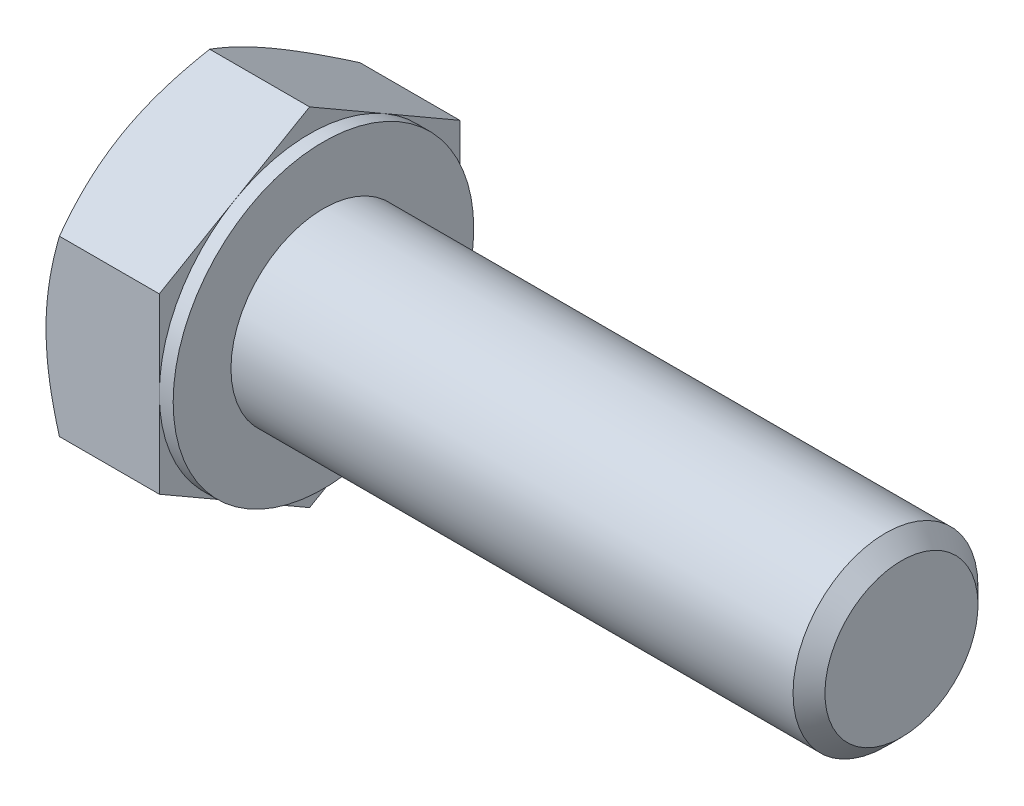
ISO-10303-21;
HEADER;
FILE_DESCRIPTION(('STEP AP214'),'2;1');
FILE_NAME('part.step','',(''),(''),'','','');
FILE_SCHEMA(('AUTOMOTIVE_DESIGN { 1 0 10303 214 1 1 1 1 }'));
ENDSEC;
DATA;
#1=APPLICATION_CONTEXT('core data for automotive mechanical design processes');
#2=APPLICATION_PROTOCOL_DEFINITION('international standard','automotive_design',2000,#1);
#3=PRODUCT_CONTEXT('',#1,'mechanical');
#4=PRODUCT('Part','Part','',(#3));
#5=PRODUCT_RELATED_PRODUCT_CATEGORY('part','',(#4));
#6=PRODUCT_DEFINITION_FORMATION('','',#4);
#7=PRODUCT_DEFINITION_CONTEXT('part definition',#1,'design');
#8=PRODUCT_DEFINITION('design','',#6,#7);
#9=PRODUCT_DEFINITION_SHAPE('','',#8);
#10=(LENGTH_UNIT() NAMED_UNIT(*) SI_UNIT(.MILLI.,.METRE.));
#11=(NAMED_UNIT(*) PLANE_ANGLE_UNIT() SI_UNIT($,.RADIAN.));
#12=(NAMED_UNIT(*) SI_UNIT($,.STERADIAN.) SOLID_ANGLE_UNIT());
#13=UNCERTAINTY_MEASURE_WITH_UNIT(LENGTH_MEASURE(1.E-05),#10,'distance_accuracy_value','');
#14=(GEOMETRIC_REPRESENTATION_CONTEXT(3) GLOBAL_UNCERTAINTY_ASSIGNED_CONTEXT((#13)) GLOBAL_UNIT_ASSIGNED_CONTEXT((#10,
#11,#12)) REPRESENTATION_CONTEXT('',''));
#15=CARTESIAN_POINT('',(0.,0.,0.));
#16=DIRECTION('',(0.,0.,1.));
#17=DIRECTION('',(1.,0.,0.));
#18=AXIS2_PLACEMENT_3D('',#15,#16,#17);
#19=CARTESIAN_POINT('',(0.,7.50555349946514,0.));
#20=DIRECTION('',(1.,0.,0.));
#21=DIRECTION('',(0.,0.,-1.));
#22=AXIS2_PLACEMENT_3D('',#19,#20,#21);
#23=PLANE('',#22);
#24=CARTESIAN_POINT('',(0.,0.,0.));
#25=DIRECTION('',(1.,0.,0.));
#26=DIRECTION('',(0.,0.,-1.));
#27=AXIS2_PLACEMENT_3D('',#24,#25,#26);
#28=CIRCLE('',#27,6.49999999995998);
#29=CARTESIAN_POINT('',(1.15546531814981E-11,-5.62916512458152,-3.24999999999));
#30=VERTEX_POINT('',#29);
#31=CARTESIAN_POINT('',(1.15518155498369E-11,0.,-6.49999999997999));
#32=VERTEX_POINT('',#31);
#33=EDGE_CURVE('E85',#30,#32,#28,.T.);
#34=ORIENTED_EDGE('',*,*,#33,.F.);
#35=CARTESIAN_POINT('',(0.,0.,0.));
#36=DIRECTION('',(1.,0.,0.));
#37=DIRECTION('',(0.,0.,-1.));
#38=AXIS2_PLACEMENT_3D('',#35,#36,#37);
#39=CIRCLE('',#38,6.49999999995998);
#40=CARTESIAN_POINT('',(1.15535774221326E-11,-5.62916512458152,3.24999999999001));
#41=VERTEX_POINT('',#40);
#42=EDGE_CURVE('E20',#41,#30,#39,.T.);
#43=ORIENTED_EDGE('',*,*,#42,.F.);
#44=CARTESIAN_POINT('',(0.,0.,0.));
#45=DIRECTION('',(1.,0.,0.));
#46=DIRECTION('',(0.,0.,-1.));
#47=AXIS2_PLACEMENT_3D('',#44,#45,#46);
#48=CIRCLE('',#47,6.49999999995998);
#49=CARTESIAN_POINT('',(1.15519510751084E-11,0.,6.49999999997999));
#50=VERTEX_POINT('',#49);
#51=EDGE_CURVE('E425',#50,#41,#48,.T.);
#52=ORIENTED_EDGE('',*,*,#51,.F.);
#53=CARTESIAN_POINT('',(0.,0.,0.));
#54=DIRECTION('',(1.,0.,0.));
#55=DIRECTION('',(0.,0.,-1.));
#56=AXIS2_PLACEMENT_3D('',#53,#54,#55);
#57=CIRCLE('',#56,6.49999999995998);
#58=CARTESIAN_POINT('',(1.1552080213042E-11,5.62916512458152,3.24999999999));
#59=VERTEX_POINT('',#58);
#60=EDGE_CURVE('E143',#59,#50,#57,.T.);
#61=ORIENTED_EDGE('',*,*,#60,.F.);
#62=CARTESIAN_POINT('',(0.,0.,0.));
#63=DIRECTION('',(1.,0.,0.));
#64=DIRECTION('',(0.,0.,-1.));
#65=AXIS2_PLACEMENT_3D('',#62,#63,#64);
#66=CIRCLE('',#65,6.49999999995998);
#67=CARTESIAN_POINT('',(1.15517781399171E-11,5.62916512458152,-3.24999999999));
#68=VERTEX_POINT('',#67);
#69=EDGE_CURVE('E426',#68,#59,#66,.T.);
#70=ORIENTED_EDGE('',*,*,#69,.F.);
#71=CARTESIAN_POINT('',(0.,0.,0.));
#72=DIRECTION('',(1.,0.,0.));
#73=DIRECTION('',(0.,0.,-1.));
#74=AXIS2_PLACEMENT_3D('',#71,#72,#73);
#75=CIRCLE('',#74,6.49999999995998);
#76=EDGE_CURVE('E88',#32,#68,#75,.T.);
#77=ORIENTED_EDGE('',*,*,#76,.F.);
#78=EDGE_LOOP('',(#34,#43,#52,#61,#70,#77));
#79=FACE_BOUND('',#78,.T.);
#80=ADVANCED_FACE('F17',(#79),#23,.F.);
#81=CARTESIAN_POINT('',(0.584039923069213,0.,0.));
#82=DIRECTION('',(1.,0.,0.));
#83=DIRECTION('',(0.,0.,-1.));
#84=AXIS2_PLACEMENT_3D('',#81,#82,#83);
#85=CONICAL_SURFACE('',#84,7.51158682032838,1.04719755118114);
#86=ORIENTED_EDGE('',*,*,#42,.T.);
#87=CARTESIAN_POINT('',(2.38325579768452E-11,-5.62916512459777,-3.24999999999938));
#88=CARTESIAN_POINT('',(-2.65652344197939E-05,-5.70880728473444,-3.11205573221975));
#89=CARTESIAN_POINT('',(0.0033797276327546,-5.78844560823781,-2.97411810968296));
#90=CARTESIAN_POINT('',(0.016860583058583,-5.94756588426545,-2.69851370708918));
#91=CARTESIAN_POINT('',(0.0269338255103951,-6.0270478646226,-2.56084687882423));
#92=CARTESIAN_POINT('',(0.0534848017047234,-6.18534206384329,-2.28667328323044));
#93=CARTESIAN_POINT('',(0.0699302938058354,-6.26415564509039,-2.15016415618406));
#94=CARTESIAN_POINT('',(0.108872020471756,-6.42140731241903,-1.87779627879596));
#95=CARTESIAN_POINT('',(0.131368414300897,-6.49984538856168,-1.74193754566893));
#96=CARTESIAN_POINT('',(0.207238975570002,-6.73427122699104,-1.33590008290232));
#97=CARTESIAN_POINT('',(0.269031363404723,-6.88957797343333,-1.06690090730607));
#98=CARTESIAN_POINT('',(0.41154041463193,-7.19885589649827,-0.531215830898221));
#99=CARTESIAN_POINT('',(0.492351589124999,-7.35281628522807,-0.264548615265171));
#100=CARTESIAN_POINT('',(0.580556583641226,-7.50555349945931,-1.01125705032068E-11));
#101=B_SPLINE_CURVE_WITH_KNOTS('',3,(#87,#88,#89,#90,#91,#92,#93,#94,#95,#96,#97,#98,#99,#100),
.UNSPECIFIED.,.F.,.F.,(4,2,2,2,2,2,4),(0.,0.4778041950496,0.95551380951934,1.43083727329502,
1.90617324917007,2.85559935539958,3.80984701130552),.UNSPECIFIED.);
#102=CARTESIAN_POINT('',(0.580556583641226,-7.50555349945931,0.));
#103=VERTEX_POINT('',#102);
#104=EDGE_CURVE('E100',#30,#103,#101,.T.);
#105=ORIENTED_EDGE('',*,*,#104,.T.);
#106=CARTESIAN_POINT('',(0.580556583641226,-7.50555349945931,1.01147123436235E-11));
#107=CARTESIAN_POINT('',(0.492351589125005,-7.35281628522806,0.264548615265161));
#108=CARTESIAN_POINT('',(0.411540414631936,-7.19885589649828,0.531215830898202));
#109=CARTESIAN_POINT('',(0.269031363404727,-6.88957797343335,1.06690090730604));
#110=CARTESIAN_POINT('',(0.207238975570004,-6.73427122699106,1.33590008290229));
#111=CARTESIAN_POINT('',(0.131368414300904,-6.49984538856169,1.74193754566889));
#112=CARTESIAN_POINT('',(0.108872020471767,-6.42140731241905,1.87779627879591));
#113=CARTESIAN_POINT('',(0.0699302938058367,-6.26415564509043,2.150164156184));
#114=CARTESIAN_POINT('',(0.0534848017047109,-6.18534206384335,2.28667328323039));
#115=CARTESIAN_POINT('',(0.0269338255104189,-6.02704786462262,2.56084687882413));
#116=CARTESIAN_POINT('',(0.0168605830586569,-5.9475658842654,2.69851370708902));
#117=CARTESIAN_POINT('',(0.00337972763268682,-5.78844560823798,2.9741181096829));
#118=CARTESIAN_POINT('',(-2.65652346796055E-05,-5.7088072847349,3.11205573221983));
#119=CARTESIAN_POINT('',(2.31066127431789E-11,-5.62916512459895,3.24999999999984));
#120=B_SPLINE_CURVE_WITH_KNOTS('',3,(#106,#107,#108,#109,#110,#111,#112,#113,#114,#115,#116,
#117,#118,#119),.UNSPECIFIED.,.F.,.F.,(4,2,2,2,2,2,4),(0.,0.954247655905908,1.90367376213542,
2.37900973801043,2.85433320178609,3.33204281625579,3.80984701130534),.UNSPECIFIED.);
#121=EDGE_CURVE('E106',#103,#41,#120,.T.);
#122=ORIENTED_EDGE('',*,*,#121,.T.);
#123=EDGE_LOOP('',(#86,#105,#122));
#124=FACE_BOUND('',#123,.T.);
#125=ADVANCED_FACE('F104',(#124),#85,.T.);
#126=CARTESIAN_POINT('',(0.584039923069213,0.,0.));
#127=DIRECTION('',(1.,0.,0.));
#128=DIRECTION('',(0.,0.,-1.));
#129=AXIS2_PLACEMENT_3D('',#126,#127,#128);
#130=CONICAL_SURFACE('',#129,7.51158682032838,1.04719755118114);
#131=ORIENTED_EDGE('',*,*,#33,.T.);
#132=CARTESIAN_POINT('',(2.38257762244022E-11,0.,-6.49999999999875));
#133=CARTESIAN_POINT('',(-2.65652344264496E-05,-0.159284320271938,-6.49999999999955));
#134=CARTESIAN_POINT('',(0.00337972763274824,-0.318560967278108,-6.49999999999988));
#135=CARTESIAN_POINT('',(0.0168605830585772,-0.636801519332982,-6.50000000000012));
#136=CARTESIAN_POINT('',(0.0269338255103896,-0.79576548004743,-6.50000000000003));
#137=CARTESIAN_POINT('',(0.053484801704718,-1.11235387848891,-6.49999999999997));
#138=CARTESIAN_POINT('',(0.0699302938058299,-1.26998104098307,-6.49999999999999));
#139=CARTESIAN_POINT('',(0.10887202047175,-1.58448437564033,-6.50000000000001));
#140=CARTESIAN_POINT('',(0.131368414300891,-1.74136052792563,-6.5));
#141=CARTESIAN_POINT('',(0.207238975569996,-2.21021220478437,-6.49999999999999));
#142=CARTESIAN_POINT('',(0.269031363404717,-2.52082569766895,-6.5));
#143=CARTESIAN_POINT('',(0.411540414631923,-3.13938154379882,-6.5));
#144=CARTESIAN_POINT('',(0.492351589124993,-3.4473023212584,-6.50000000000001));
#145=CARTESIAN_POINT('',(0.58055658364122,-3.7527767497209,-6.5));
#146=B_SPLINE_CURVE_WITH_KNOTS('',3,(#132,#133,#134,#135,#136,#137,#138,#139,#140,#141,#142,
#143,#144,#145),.UNSPECIFIED.,.F.,.F.,(4,2,2,2,2,2,4),(0.,0.477804195049599,0.955513809519338,
1.43083727329502,1.90617324917006,2.85559935539958,3.80984701130552),.UNSPECIFIED.);
#147=CARTESIAN_POINT('',(0.58055658364122,-3.75277674972966,-6.49999999999494));
#148=VERTEX_POINT('',#147);
#149=EDGE_CURVE('E95',#32,#148,#146,.T.);
#150=ORIENTED_EDGE('',*,*,#149,.T.);
#151=CARTESIAN_POINT('',(0.58055658364122,-3.75277674973842,-6.49999999998988));
#152=CARTESIAN_POINT('',(0.492351589125,-3.90551396396966,-6.23545138473484));
#153=CARTESIAN_POINT('',(0.411540414631933,-4.05947435269944,-5.9687841691018));
#154=CARTESIAN_POINT('',(0.269031363404726,-4.36875227576437,-5.43309909269397));
#155=CARTESIAN_POINT('',(0.207238975570003,-4.52405902220665,-5.16409991709772));
#156=CARTESIAN_POINT('',(0.131368414300906,-4.75848486063602,-4.75806245433112));
#157=CARTESIAN_POINT('',(0.108872020471769,-4.83692293677866,-4.62220372120411));
#158=CARTESIAN_POINT('',(0.0699302938058388,-4.99417460410728,-4.34983584381602));
#159=CARTESIAN_POINT('',(0.053484801704713,-5.07298818535436,-4.21332671676963));
#160=CARTESIAN_POINT('',(0.0269338255104213,-5.23128238457509,-3.93915312117589));
#161=CARTESIAN_POINT('',(0.0168605830586596,-5.31076436493231,-3.801486292911));
#162=CARTESIAN_POINT('',(0.00337972763269,-5.46988464095972,-3.52588189031713));
#163=CARTESIAN_POINT('',(-2.65652346763305E-05,-5.5495229644628,-3.3879442677802));
#164=CARTESIAN_POINT('',(2.31095567487627E-11,-5.62916512459875,-3.25000000000019));
#165=B_SPLINE_CURVE_WITH_KNOTS('',3,(#151,#152,#153,#154,#155,#156,#157,#158,#159,#160,#161,
#162,#163,#164),.UNSPECIFIED.,.F.,.F.,(4,2,2,2,2,2,4),(0.,0.9542476559059,1.9036737621354,
2.37900973801041,2.85433320178607,3.33204281625576,3.8098470113053),.UNSPECIFIED.);
#166=EDGE_CURVE('E93',#148,#30,#165,.T.);
#167=ORIENTED_EDGE('',*,*,#166,.T.);
#168=EDGE_LOOP('',(#131,#150,#167));
#169=FACE_BOUND('',#168,.T.);
#170=ADVANCED_FACE('F94',(#169),#130,.T.);
#171=CARTESIAN_POINT('',(0.584039923069213,0.,0.));
#172=DIRECTION('',(1.,0.,0.));
#173=DIRECTION('',(0.,0.,-1.));
#174=AXIS2_PLACEMENT_3D('',#171,#172,#173);
#175=CONICAL_SURFACE('',#174,7.51158682032838,1.04719755118114);
#176=CARTESIAN_POINT('',(0.580556583641216,3.75277674972088,-6.5));
#177=CARTESIAN_POINT('',(0.492351589124997,3.4473023212584,-6.5));
#178=CARTESIAN_POINT('',(0.411540414631929,3.13938154379883,-6.5));
#179=CARTESIAN_POINT('',(0.26903136340472,2.52082569766897,-6.5));
#180=CARTESIAN_POINT('',(0.207238975569997,2.21021220478441,-6.5));
#181=CARTESIAN_POINT('',(0.131368414300899,1.74136052792568,-6.5));
#182=CARTESIAN_POINT('',(0.108872020471763,1.58448437564038,-6.5));
#183=CARTESIAN_POINT('',(0.0699302938058331,1.26998104098315,-6.5));
#184=CARTESIAN_POINT('',(0.053484801704707,1.112353878489,-6.5));
#185=CARTESIAN_POINT('',(0.0269338255104151,0.795765480047534,-6.5));
#186=CARTESIAN_POINT('',(0.0168605830586536,0.636801519333099,-6.5));
#187=CARTESIAN_POINT('',(0.00337972763268423,0.318560967278262,-6.5));
#188=CARTESIAN_POINT('',(-2.65652346820322E-05,0.159284320272115,-6.5));
#189=CARTESIAN_POINT('',(2.31036310996737E-11,2.06995547822371E-13,-6.5));
#190=B_SPLINE_CURVE_WITH_KNOTS('',3,(#176,#177,#178,#179,#180,#181,#182,#183,#184,#185,#186,
#187,#188,#189),.UNSPECIFIED.,.F.,.F.,(4,2,2,2,2,2,4),(0.,0.954247655905902,1.9036737621354,
2.37900973801042,2.85433320178607,3.33204281625577,3.80984701130531),.UNSPECIFIED.);
#191=CARTESIAN_POINT('',(0.580556583641216,3.75277674972964,-6.49999999999494));
#192=VERTEX_POINT('',#191);
#193=EDGE_CURVE('E114',#192,#32,#190,.T.);
#194=ORIENTED_EDGE('',*,*,#193,.T.);
#195=ORIENTED_EDGE('',*,*,#76,.T.);
#196=CARTESIAN_POINT('',(2.38253841741424E-11,5.62916512459776,-3.24999999999938));
#197=CARTESIAN_POINT('',(-2.65652344257806E-05,5.54952296446249,-3.38794426777982));
#198=CARTESIAN_POINT('',(0.00337972763274904,5.46988464095969,-3.52588189031693));
#199=CARTESIAN_POINT('',(0.0168605830585776,5.31076436493246,-3.80148629291095));
#200=CARTESIAN_POINT('',(0.0269338255103895,5.23128238457516,-3.93915312117581));
#201=CARTESIAN_POINT('',(0.0534848017047175,5.07298818535436,-4.21332671676953));
#202=CARTESIAN_POINT('',(0.0699302938058295,4.9941746041073,-4.34983584381594));
#203=CARTESIAN_POINT('',(0.108872020471749,4.83692293677869,-4.62220372120405));
#204=CARTESIAN_POINT('',(0.13136841430089,4.75848486063604,-4.75806245433108));
#205=CARTESIAN_POINT('',(0.207238975569994,4.52405902220666,-5.16409991709768));
#206=CARTESIAN_POINT('',(0.269031363404715,4.36875227576437,-5.43309909269393));
#207=CARTESIAN_POINT('',(0.411540414631921,4.05947435269944,-5.96878416910178));
#208=CARTESIAN_POINT('',(0.492351589124989,3.90551396396965,-6.23545138473483));
#209=CARTESIAN_POINT('',(0.580556583641216,3.7527767497384,-6.49999999998989));
#210=B_SPLINE_CURVE_WITH_KNOTS('',3,(#196,#197,#198,#199,#200,#201,#202,#203,#204,#205,#206,
#207,#208,#209),.UNSPECIFIED.,.F.,.F.,(4,2,2,2,2,2,4),(0.,0.477804195049598,0.955513809519334,
1.43083727329501,1.90617324917006,2.85559935539956,3.8098470113055),.UNSPECIFIED.);
#211=EDGE_CURVE('E219',#68,#192,#210,.T.);
#212=ORIENTED_EDGE('',*,*,#211,.T.);
#213=EDGE_LOOP('',(#194,#195,#212));
#214=FACE_BOUND('',#213,.T.);
#215=ADVANCED_FACE('F209',(#214),#175,.T.);
#216=CARTESIAN_POINT('',(0.584039923069213,0.,0.));
#217=DIRECTION('',(1.,0.,0.));
#218=DIRECTION('',(0.,0.,-1.));
#219=AXIS2_PLACEMENT_3D('',#216,#217,#218);
#220=CONICAL_SURFACE('',#219,7.51158682032838,1.04719755118114);
#221=CARTESIAN_POINT('',(0.580556583641221,7.5055534994593,-1.01144862034732E-11));
#222=CARTESIAN_POINT('',(0.492351589125001,7.35281628522806,-0.26454861526516));
#223=CARTESIAN_POINT('',(0.411540414631932,7.19885589649827,-0.531215830898201));
#224=CARTESIAN_POINT('',(0.269031363404723,6.88957797343334,-1.06690090730603));
#225=CARTESIAN_POINT('',(0.20723897557,6.73427122699106,-1.33590008290229));
#226=CARTESIAN_POINT('',(0.131368414300901,6.49984538856169,-1.74193754566888));
#227=CARTESIAN_POINT('',(0.108872020471764,6.42140731241904,-1.8777962787959));
#228=CARTESIAN_POINT('',(0.0699302938058345,6.26415564509043,-2.15016415618399));
#229=CARTESIAN_POINT('',(0.0534848017047085,6.18534206384335,-2.28667328323038));
#230=CARTESIAN_POINT('',(0.0269338255104163,6.02704786462262,-2.56084687882412));
#231=CARTESIAN_POINT('',(0.0168605830586543,5.9475658842654,-2.69851370708901));
#232=CARTESIAN_POINT('',(0.00337972763268413,5.78844560823798,-2.97411810968289));
#233=CARTESIAN_POINT('',(-2.65652346823943E-05,5.70880728473491,-3.11205573221982));
#234=CARTESIAN_POINT('',(2.31035562798342E-11,5.62916512459895,-3.24999999999983));
#235=B_SPLINE_CURVE_WITH_KNOTS('',3,(#221,#222,#223,#224,#225,#226,#227,#228,#229,#230,#231,
#232,#233,#234),.UNSPECIFIED.,.F.,.F.,(4,2,2,2,2,2,4),(0.,0.954247655905905,1.90367376213541,
2.37900973801043,2.85433320178608,3.33204281625578,3.80984701130532),.UNSPECIFIED.);
#236=CARTESIAN_POINT('',(0.580556583641221,7.5055534994593,0.));
#237=VERTEX_POINT('',#236);
#238=EDGE_CURVE('E214',#237,#68,#235,.T.);
#239=ORIENTED_EDGE('',*,*,#238,.T.);
#240=ORIENTED_EDGE('',*,*,#69,.T.);
#241=CARTESIAN_POINT('',(2.38257500923756E-11,5.62916512459776,3.24999999999938));
#242=CARTESIAN_POINT('',(-2.65652344257552E-05,5.70880728473443,3.11205573221975));
#243=CARTESIAN_POINT('',(0.00337972763274897,5.7884456082378,2.97411810968296));
#244=CARTESIAN_POINT('',(0.0168605830585776,5.94756588426544,2.69851370708918));
#245=CARTESIAN_POINT('',(0.0269338255103896,6.02704786462259,2.56084687882423));
#246=CARTESIAN_POINT('',(0.0534848017047181,6.18534206384328,2.28667328323044));
#247=CARTESIAN_POINT('',(0.0699302938058302,6.26415564509038,2.15016415618406));
#248=CARTESIAN_POINT('',(0.10887202047175,6.42140731241902,1.87779627879596));
#249=CARTESIAN_POINT('',(0.131368414300891,6.49984538856167,1.74193754566893));
#250=CARTESIAN_POINT('',(0.207238975569995,6.73427122699103,1.33590008290232));
#251=CARTESIAN_POINT('',(0.269031363404717,6.88957797343332,1.06690090730607));
#252=CARTESIAN_POINT('',(0.411540414631924,7.19885589649826,0.531215830898222));
#253=CARTESIAN_POINT('',(0.492351589124994,7.35281628522806,0.264548615265173));
#254=CARTESIAN_POINT('',(0.580556583641221,7.5055534994593,1.01137987216797E-11));
#255=B_SPLINE_CURVE_WITH_KNOTS('',3,(#241,#242,#243,#244,#245,#246,#247,#248,#249,#250,#251,
#252,#253,#254),.UNSPECIFIED.,.F.,.F.,(4,2,2,2,2,2,4),(0.,0.4778041950496,0.955513809519338,
1.43083727329502,1.90617324917006,2.85559935539958,3.80984701130552),.UNSPECIFIED.);
#256=EDGE_CURVE('E201',#59,#237,#255,.T.);
#257=ORIENTED_EDGE('',*,*,#256,.T.);
#258=EDGE_LOOP('',(#239,#240,#257));
#259=FACE_BOUND('',#258,.T.);
#260=ADVANCED_FACE('F206',(#259),#220,.T.);
#261=CARTESIAN_POINT('',(0.584039923069213,0.,0.));
#262=DIRECTION('',(1.,0.,0.));
#263=DIRECTION('',(0.,0.,-1.));
#264=AXIS2_PLACEMENT_3D('',#261,#262,#263);
#265=CONICAL_SURFACE('',#264,7.51158682032838,1.04719755118114);
#266=ORIENTED_EDGE('',*,*,#51,.T.);
#267=CARTESIAN_POINT('',(2.38300876645125E-11,-5.62916512459776,3.24999999999939));
#268=CARTESIAN_POINT('',(-2.65652344226972E-05,-5.54952296446249,3.38794426777983));
#269=CARTESIAN_POINT('',(0.00337972763275166,-5.46988464095969,3.52588189031694));
#270=CARTESIAN_POINT('',(0.0168605830585802,-5.31076436493246,3.80148629291096));
#271=CARTESIAN_POINT('',(0.0269338255103924,-5.23128238457516,3.93915312117582));
#272=CARTESIAN_POINT('',(0.0534848017047206,-5.07298818535436,4.21332671676954));
#273=CARTESIAN_POINT('',(0.0699302938058323,-4.9941746041073,4.34983584381595));
#274=CARTESIAN_POINT('',(0.108872020471752,-4.83692293677869,4.62220372120406));
#275=CARTESIAN_POINT('',(0.131368414300893,-4.75848486063604,4.75806245433109));
#276=CARTESIAN_POINT('',(0.207238975569996,-4.52405902220666,5.16409991709768));
#277=CARTESIAN_POINT('',(0.269031363404717,-4.36875227576437,5.43309909269394));
#278=CARTESIAN_POINT('',(0.411540414631922,-4.05947435269944,5.96878416910179));
#279=CARTESIAN_POINT('',(0.492351589124991,-3.90551396396965,6.23545138473484));
#280=CARTESIAN_POINT('',(0.580556583641217,-3.7527767497384,6.49999999998989));
#281=B_SPLINE_CURVE_WITH_KNOTS('',3,(#267,#268,#269,#270,#271,#272,#273,#274,#275,#276,#277,
#278,#279,#280),.UNSPECIFIED.,.F.,.F.,(4,2,2,2,2,2,4),(0.,0.477804195049597,0.955513809519332,
1.43083727329501,1.90617324917005,2.85559935539956,3.80984701130549),.UNSPECIFIED.);
#282=CARTESIAN_POINT('',(0.580556583642902,-3.75277674973548,6.49999999999494));
#283=VERTEX_POINT('',#282);
#284=EDGE_CURVE('E101',#41,#283,#281,.T.);
#285=ORIENTED_EDGE('',*,*,#284,.T.);
#286=CARTESIAN_POINT('',(0.580556583641216,-3.75277674972088,6.5));
#287=CARTESIAN_POINT('',(0.492351589124997,-3.4473023212584,6.5));
#288=CARTESIAN_POINT('',(0.411540414631929,-3.13938154379883,6.5));
#289=CARTESIAN_POINT('',(0.269031363404721,-2.52082569766897,6.5));
#290=CARTESIAN_POINT('',(0.207238975569998,-2.21021220478441,6.5));
#291=CARTESIAN_POINT('',(0.1313684143009,-1.74136052792568,6.5));
#292=CARTESIAN_POINT('',(0.108872020471763,-1.58448437564038,6.5));
#293=CARTESIAN_POINT('',(0.0699302938058334,-1.26998104098315,6.5));
#294=CARTESIAN_POINT('',(0.0534848017047079,-1.112353878489,6.5));
#295=CARTESIAN_POINT('',(0.026933825510416,-0.795765480047534,6.5));
#296=CARTESIAN_POINT('',(0.0168605830586538,-0.636801519333099,6.5));
#297=CARTESIAN_POINT('',(0.00337972763268369,-0.318560967278262,6.5));
#298=CARTESIAN_POINT('',(-2.65652346827006E-05,-0.159284320272115,6.5));
#299=CARTESIAN_POINT('',(2.31039021502168E-11,-2.0623652689199E-13,6.5));
#300=B_SPLINE_CURVE_WITH_KNOTS('',3,(#286,#287,#288,#289,#290,#291,#292,#293,#294,#295,#296,
#297,#298,#299),.UNSPECIFIED.,.F.,.F.,(4,2,2,2,2,2,4),(0.,0.954247655905902,1.9036737621354,
2.37900973801042,2.85433320178607,3.33204281625577,3.80984701130531),.UNSPECIFIED.);
#301=EDGE_CURVE('E180',#283,#50,#300,.T.);
#302=ORIENTED_EDGE('',*,*,#301,.T.);
#303=EDGE_LOOP('',(#266,#285,#302));
#304=FACE_BOUND('',#303,.T.);
#305=ADVANCED_FACE('F158',(#304),#265,.T.);
#306=CARTESIAN_POINT('',(0.584039923069213,0.,0.));
#307=DIRECTION('',(1.,0.,0.));
#308=DIRECTION('',(0.,0.,-1.));
#309=AXIS2_PLACEMENT_3D('',#306,#307,#308);
#310=CONICAL_SURFACE('',#309,7.51158682032838,1.04719755118114);
#311=CARTESIAN_POINT('',(0.580556583641216,3.7527767497384,6.49999999998989));
#312=CARTESIAN_POINT('',(0.492351589124997,3.90551396396964,6.23545138473484));
#313=CARTESIAN_POINT('',(0.411540414631929,4.05947435269943,5.9687841691018));
#314=CARTESIAN_POINT('',(0.269031363404721,4.36875227576436,5.43309909269397));
#315=CARTESIAN_POINT('',(0.207238975569998,4.52405902220664,5.16409991709772));
#316=CARTESIAN_POINT('',(0.1313684143009,4.75848486063601,4.75806245433112));
#317=CARTESIAN_POINT('',(0.108872020471763,4.83692293677865,4.6222037212041));
#318=CARTESIAN_POINT('',(0.0699302938058336,4.99417460410727,4.34983584381602));
#319=CARTESIAN_POINT('',(0.053484801704708,5.07298818535435,4.21332671676963));
#320=CARTESIAN_POINT('',(0.0269338255104162,5.23128238457508,3.93915312117589));
#321=CARTESIAN_POINT('',(0.0168605830586542,5.3107643649323,3.801486292911));
#322=CARTESIAN_POINT('',(0.0033797276326841,5.46988464095971,3.52588189031713));
#323=CARTESIAN_POINT('',(-2.65652346823871E-05,5.54952296446279,3.3879442677802));
#324=CARTESIAN_POINT('',(2.3103743517881E-11,5.62916512459874,3.25000000000019));
#325=B_SPLINE_CURVE_WITH_KNOTS('',3,(#311,#312,#313,#314,#315,#316,#317,#318,#319,#320,#321,
#322,#323,#324),.UNSPECIFIED.,.F.,.F.,(4,2,2,2,2,2,4),(0.,0.9542476559059,1.9036737621354,
2.37900973801042,2.85433320178607,3.33204281625577,3.80984701130531),.UNSPECIFIED.);
#326=CARTESIAN_POINT('',(0.580556583641216,3.75277674972964,6.49999999999494));
#327=VERTEX_POINT('',#326);
#328=EDGE_CURVE('E164',#327,#59,#325,.T.);
#329=ORIENTED_EDGE('',*,*,#328,.T.);
#330=ORIENTED_EDGE('',*,*,#60,.T.);
#331=CARTESIAN_POINT('',(2.38257917229847E-11,0.,6.49999999999875));
#332=CARTESIAN_POINT('',(-2.65652344260361E-05,0.159284320271937,6.49999999999955));
#333=CARTESIAN_POINT('',(0.00337972763274861,0.318560967278107,6.49999999999988));
#334=CARTESIAN_POINT('',(0.0168605830585772,0.63680151933298,6.50000000000012));
#335=CARTESIAN_POINT('',(0.0269338255103893,0.795765480047427,6.50000000000003));
#336=CARTESIAN_POINT('',(0.0534848017047176,1.11235387848891,6.49999999999997));
#337=CARTESIAN_POINT('',(0.0699302938058295,1.26998104098307,6.49999999999999));
#338=CARTESIAN_POINT('',(0.108872020471749,1.58448437564032,6.50000000000001));
#339=CARTESIAN_POINT('',(0.13136841430089,1.74136052792562,6.5));
#340=CARTESIAN_POINT('',(0.207238975569994,2.21021220478437,6.49999999999999));
#341=CARTESIAN_POINT('',(0.269031363404715,2.52082569766894,6.5));
#342=CARTESIAN_POINT('',(0.411540414631921,3.13938154379881,6.5));
#343=CARTESIAN_POINT('',(0.492351589124989,3.44730232125839,6.50000000000001));
#344=CARTESIAN_POINT('',(0.580556583641216,3.75277674972088,6.5));
#345=B_SPLINE_CURVE_WITH_KNOTS('',3,(#331,#332,#333,#334,#335,#336,#337,#338,#339,#340,#341,
#342,#343,#344),.UNSPECIFIED.,.F.,.F.,(4,2,2,2,2,2,4),(0.,0.477804195049598,0.955513809519334,
1.43083727329501,1.90617324917006,2.85559935539956,3.8098470113055),.UNSPECIFIED.);
#346=EDGE_CURVE('E172',#50,#327,#345,.T.);
#347=ORIENTED_EDGE('',*,*,#346,.T.);
#348=EDGE_LOOP('',(#329,#330,#347));
#349=FACE_BOUND('',#348,.T.);
#350=ADVANCED_FACE('F153',(#349),#310,.T.);
#351=CARTESIAN_POINT('',(5.5,-7.50555349946515,0.));
#352=DIRECTION('',(0.,0.866025403784438,-0.500000000000002));
#353=DIRECTION('',(0.,0.500000000000002,0.866025403784438));
#354=AXIS2_PLACEMENT_3D('',#351,#352,#353);
#355=PLANE('',#354);
#356=DIRECTION('',(1.,0.,0.));
#357=VECTOR('',#356,1.);
#358=CARTESIAN_POINT('',(5.5,-3.75277674973256,6.5));
#359=LINE('',#358,#357);
#360=CARTESIAN_POINT('',(4.9,-3.75277674973256,6.5));
#361=VERTEX_POINT('',#360);
#362=EDGE_CURVE('E339',#361,#283,#359,.F.);
#363=ORIENTED_EDGE('',*,*,#362,.T.);
#364=ORIENTED_EDGE('',*,*,#284,.F.);
#365=ORIENTED_EDGE('',*,*,#121,.F.);
#366=DIRECTION('',(1.,0.,0.));
#367=VECTOR('',#366,1.);
#368=CARTESIAN_POINT('',(5.5,-7.50555349946515,0.));
#369=LINE('',#368,#367);
#370=CARTESIAN_POINT('',(4.9,-7.50555349946515,0.));
#371=VERTEX_POINT('',#370);
#372=EDGE_CURVE('E112',#103,#371,#369,.T.);
#373=ORIENTED_EDGE('',*,*,#372,.T.);
#374=DIRECTION('',(0.,-0.500000000000003,-0.866025403784437));
#375=VECTOR('',#374,1.);
#376=CARTESIAN_POINT('',(4.9,-5.62916512459884,3.25000000000001));
#377=LINE('',#376,#375);
#378=CARTESIAN_POINT('',(4.9,-5.62916512459885,3.25000000000001));
#379=VERTEX_POINT('',#378);
#380=EDGE_CURVE('E293',#379,#371,#377,.T.);
#381=ORIENTED_EDGE('',*,*,#380,.F.);
#382=DIRECTION('',(0.,-0.500000000000001,-0.866025403784438));
#383=VECTOR('',#382,1.);
#384=CARTESIAN_POINT('',(4.9,-3.75277674973256,6.5));
#385=LINE('',#384,#383);
#386=EDGE_CURVE('E351',#361,#379,#385,.T.);
#387=ORIENTED_EDGE('',*,*,#386,.F.);
#388=EDGE_LOOP('',(#363,#364,#365,#373,#381,#387));
#389=FACE_BOUND('',#388,.T.);
#390=ADVANCED_FACE('F149',(#389),#355,.F.);
#391=CARTESIAN_POINT('',(5.5,-3.75277674973258,-6.5));
#392=DIRECTION('',(0.,0.866025403784438,0.500000000000001));
#393=DIRECTION('',(0.,-0.500000000000001,0.866025403784438));
#394=AXIS2_PLACEMENT_3D('',#391,#392,#393);
#395=PLANE('',#394);
#396=ORIENTED_EDGE('',*,*,#372,.F.);
#397=ORIENTED_EDGE('',*,*,#104,.F.);
#398=ORIENTED_EDGE('',*,*,#166,.F.);
#399=DIRECTION('',(1.,0.,0.));
#400=VECTOR('',#399,1.);
#401=CARTESIAN_POINT('',(5.5,-3.75277674973258,-6.5));
#402=LINE('',#401,#400);
#403=CARTESIAN_POINT('',(4.9,-3.75277674973258,-6.5));
#404=VERTEX_POINT('',#403);
#405=EDGE_CURVE('E220',#148,#404,#402,.T.);
#406=ORIENTED_EDGE('',*,*,#405,.T.);
#407=DIRECTION('',(0.,0.499999999999998,-0.86602540378444));
#408=VECTOR('',#407,1.);
#409=CARTESIAN_POINT('',(4.9,-5.62916512459885,-3.25));
#410=LINE('',#409,#408);
#411=CARTESIAN_POINT('',(4.9,-5.62916512459885,-3.25));
#412=VERTEX_POINT('',#411);
#413=EDGE_CURVE('E296',#412,#404,#410,.T.);
#414=ORIENTED_EDGE('',*,*,#413,.F.);
#415=DIRECTION('',(0.,0.500000000000003,-0.866025403784437));
#416=VECTOR('',#415,1.);
#417=CARTESIAN_POINT('',(4.9,-7.50555349946515,0.));
#418=LINE('',#417,#416);
#419=EDGE_CURVE('E287',#371,#412,#418,.T.);
#420=ORIENTED_EDGE('',*,*,#419,.F.);
#421=EDGE_LOOP('',(#396,#397,#398,#406,#414,#420));
#422=FACE_BOUND('',#421,.T.);
#423=ADVANCED_FACE('F109',(#422),#395,.F.);
#424=CARTESIAN_POINT('',(5.5,3.75277674973256,-6.5));
#425=DIRECTION('',(0.,0.,1.));
#426=DIRECTION('',(1.,0.,0.));
#427=AXIS2_PLACEMENT_3D('',#424,#425,#426);
#428=PLANE('',#427);
#429=ORIENTED_EDGE('',*,*,#405,.F.);
#430=ORIENTED_EDGE('',*,*,#149,.F.);
#431=ORIENTED_EDGE('',*,*,#193,.F.);
#432=DIRECTION('',(1.,0.,0.));
#433=VECTOR('',#432,1.);
#434=CARTESIAN_POINT('',(5.5,3.75277674973256,-6.5));
#435=LINE('',#434,#433);
#436=CARTESIAN_POINT('',(4.9,3.75277674973256,-6.5));
#437=VERTEX_POINT('',#436);
#438=EDGE_CURVE('E332',#192,#437,#435,.T.);
#439=ORIENTED_EDGE('',*,*,#438,.T.);
#440=DIRECTION('',(0.,1.,0.));
#441=VECTOR('',#440,1.);
#442=CARTESIAN_POINT('',(4.9,6.5,-6.5));
#443=LINE('',#442,#441);
#444=CARTESIAN_POINT('',(4.9,0.,-6.5));
#445=VERTEX_POINT('',#444);
#446=EDGE_CURVE('E372',#445,#437,#443,.T.);
#447=ORIENTED_EDGE('',*,*,#446,.F.);
#448=DIRECTION('',(0.,1.,0.));
#449=VECTOR('',#448,1.);
#450=CARTESIAN_POINT('',(4.9,6.5,-6.5));
#451=LINE('',#450,#449);
#452=EDGE_CURVE('E304',#404,#445,#451,.T.);
#453=ORIENTED_EDGE('',*,*,#452,.F.);
#454=EDGE_LOOP('',(#429,#430,#431,#439,#447,#453));
#455=FACE_BOUND('',#454,.T.);
#456=ADVANCED_FACE('F227',(#455),#428,.F.);
#457=CARTESIAN_POINT('',(5.5,3.75277674973256,-6.5));
#458=DIRECTION('',(0.,-0.866025403784438,0.500000000000001));
#459=DIRECTION('',(0.,-0.500000000000001,-0.866025403784438));
#460=AXIS2_PLACEMENT_3D('',#457,#458,#459);
#461=PLANE('',#460);
#462=ORIENTED_EDGE('',*,*,#438,.F.);
#463=ORIENTED_EDGE('',*,*,#211,.F.);
#464=ORIENTED_EDGE('',*,*,#238,.F.);
#465=DIRECTION('',(1.,0.,0.));
#466=VECTOR('',#465,1.);
#467=CARTESIAN_POINT('',(5.5,7.50555349946514,0.));
#468=LINE('',#467,#466);
#469=CARTESIAN_POINT('',(4.9,7.50555349946514,0.));
#470=VERTEX_POINT('',#469);
#471=EDGE_CURVE('E205',#237,#470,#468,.T.);
#472=ORIENTED_EDGE('',*,*,#471,.T.);
#473=DIRECTION('',(0.,0.500000000000001,0.866025403784438));
#474=VECTOR('',#473,1.);
#475=CARTESIAN_POINT('',(4.9,5.62916512459885,-3.25000000000001));
#476=LINE('',#475,#474);
#477=CARTESIAN_POINT('',(4.9,5.62916512459885,-3.25000000000001));
#478=VERTEX_POINT('',#477);
#479=EDGE_CURVE('E377',#478,#470,#476,.T.);
#480=ORIENTED_EDGE('',*,*,#479,.F.);
#481=DIRECTION('',(0.,0.500000000000002,0.866025403784438));
#482=VECTOR('',#481,1.);
#483=CARTESIAN_POINT('',(4.9,3.75277674973256,-6.5));
#484=LINE('',#483,#482);
#485=EDGE_CURVE('E367',#437,#478,#484,.T.);
#486=ORIENTED_EDGE('',*,*,#485,.F.);
#487=EDGE_LOOP('',(#462,#463,#464,#472,#480,#486));
#488=FACE_BOUND('',#487,.T.);
#489=ADVANCED_FACE('F197',(#488),#461,.F.);
#490=CARTESIAN_POINT('',(5.5,7.50555349946514,0.));
#491=DIRECTION('',(0.,-0.866025403784438,-0.500000000000001));
#492=DIRECTION('',(0.,0.500000000000001,-0.866025403784438));
#493=AXIS2_PLACEMENT_3D('',#490,#491,#492);
#494=PLANE('',#493);
#495=ORIENTED_EDGE('',*,*,#471,.F.);
#496=ORIENTED_EDGE('',*,*,#256,.F.);
#497=ORIENTED_EDGE('',*,*,#328,.F.);
#498=DIRECTION('',(1.,0.,0.));
#499=VECTOR('',#498,1.);
#500=CARTESIAN_POINT('',(5.5,3.75277674973256,6.5));
#501=LINE('',#500,#499);
#502=CARTESIAN_POINT('',(4.9,3.75277674973256,6.5));
#503=VERTEX_POINT('',#502);
#504=EDGE_CURVE('E179',#327,#503,#501,.T.);
#505=ORIENTED_EDGE('',*,*,#504,.T.);
#506=DIRECTION('',(0.,-0.500000000000001,0.866025403784438));
#507=VECTOR('',#506,1.);
#508=CARTESIAN_POINT('',(4.9,5.62916512459885,3.25000000000001));
#509=LINE('',#508,#507);
#510=CARTESIAN_POINT('',(4.9,5.62916512459885,3.25000000000001));
#511=VERTEX_POINT('',#510);
#512=EDGE_CURVE('E387',#511,#503,#509,.T.);
#513=ORIENTED_EDGE('',*,*,#512,.F.);
#514=DIRECTION('',(0.,-0.500000000000001,0.866025403784438));
#515=VECTOR('',#514,1.);
#516=CARTESIAN_POINT('',(4.9,7.50555349946514,0.));
#517=LINE('',#516,#515);
#518=EDGE_CURVE('E382',#470,#511,#517,.T.);
#519=ORIENTED_EDGE('',*,*,#518,.F.);
#520=EDGE_LOOP('',(#495,#496,#497,#505,#513,#519));
#521=FACE_BOUND('',#520,.T.);
#522=ADVANCED_FACE('F191',(#521),#494,.F.);
#523=CARTESIAN_POINT('',(5.5,3.75277674973256,6.5));
#524=DIRECTION('',(0.,0.,-1.));
#525=DIRECTION('',(0.,1.,0.));
#526=AXIS2_PLACEMENT_3D('',#523,#524,#525);
#527=PLANE('',#526);
#528=ORIENTED_EDGE('',*,*,#504,.F.);
#529=ORIENTED_EDGE('',*,*,#346,.F.);
#530=ORIENTED_EDGE('',*,*,#301,.F.);
#531=ORIENTED_EDGE('',*,*,#362,.F.);
#532=DIRECTION('',(0.,1.,0.));
#533=VECTOR('',#532,1.);
#534=CARTESIAN_POINT('',(4.9,6.5,6.5));
#535=LINE('',#534,#533);
#536=CARTESIAN_POINT('',(4.9,0.,6.5));
#537=VERTEX_POINT('',#536);
#538=EDGE_CURVE('E35',#537,#361,#535,.F.);
#539=ORIENTED_EDGE('',*,*,#538,.F.);
#540=DIRECTION('',(0.,1.,0.));
#541=VECTOR('',#540,1.);
#542=CARTESIAN_POINT('',(4.9,6.5,6.5));
#543=LINE('',#542,#541);
#544=EDGE_CURVE('E311',#503,#537,#543,.F.);
#545=ORIENTED_EDGE('',*,*,#544,.F.);
#546=EDGE_LOOP('',(#528,#529,#530,#531,#539,#545));
#547=FACE_BOUND('',#546,.T.);
#548=ADVANCED_FACE('F186',(#547),#527,.F.);
#549=CARTESIAN_POINT('',(4.9,6.5,0.));
#550=DIRECTION('',(1.,0.,0.));
#551=DIRECTION('',(0.,0.,-1.));
#552=AXIS2_PLACEMENT_3D('',#549,#550,#551);
#553=PLANE('',#552);
#554=ORIENTED_EDGE('',*,*,#386,.T.);
#555=CARTESIAN_POINT('',(4.9,0.,0.));
#556=DIRECTION('',(-1.,0.,0.));
#557=DIRECTION('',(0.,0.,1.));
#558=AXIS2_PLACEMENT_3D('',#555,#556,#557);
#559=CIRCLE('',#558,6.5);
#560=EDGE_CURVE('E181',#537,#379,#559,.F.);
#561=ORIENTED_EDGE('',*,*,#560,.F.);
#562=ORIENTED_EDGE('',*,*,#538,.T.);
#563=EDGE_LOOP('',(#554,#561,#562));
#564=FACE_BOUND('',#563,.T.);
#565=ADVANCED_FACE('F190',(#564),#553,.T.);
#566=CARTESIAN_POINT('',(4.9,6.5,0.));
#567=DIRECTION('',(1.,0.,0.));
#568=DIRECTION('',(0.,0.,-1.));
#569=AXIS2_PLACEMENT_3D('',#566,#567,#568);
#570=PLANE('',#569);
#571=ORIENTED_EDGE('',*,*,#419,.T.);
#572=CARTESIAN_POINT('',(4.9,0.,0.));
#573=DIRECTION('',(-1.,0.,0.));
#574=DIRECTION('',(0.,0.,1.));
#575=AXIS2_PLACEMENT_3D('',#572,#573,#574);
#576=CIRCLE('',#575,6.5);
#577=EDGE_CURVE('E290',#379,#412,#576,.F.);
#578=ORIENTED_EDGE('',*,*,#577,.F.);
#579=ORIENTED_EDGE('',*,*,#380,.T.);
#580=EDGE_LOOP('',(#571,#578,#579));
#581=FACE_BOUND('',#580,.T.);
#582=ADVANCED_FACE('F276',(#581),#570,.T.);
#583=CARTESIAN_POINT('',(4.9,6.5,0.));
#584=DIRECTION('',(1.,0.,0.));
#585=DIRECTION('',(0.,0.,-1.));
#586=AXIS2_PLACEMENT_3D('',#583,#584,#585);
#587=PLANE('',#586);
#588=ORIENTED_EDGE('',*,*,#452,.T.);
#589=CARTESIAN_POINT('',(4.9,0.,0.));
#590=DIRECTION('',(-1.,0.,0.));
#591=DIRECTION('',(0.,0.,1.));
#592=AXIS2_PLACEMENT_3D('',#589,#590,#591);
#593=CIRCLE('',#592,6.5);
#594=EDGE_CURVE('E301',#412,#445,#593,.F.);
#595=ORIENTED_EDGE('',*,*,#594,.F.);
#596=ORIENTED_EDGE('',*,*,#413,.T.);
#597=EDGE_LOOP('',(#588,#595,#596));
#598=FACE_BOUND('',#597,.T.);
#599=ADVANCED_FACE('F273',(#598),#587,.T.);
#600=CARTESIAN_POINT('',(4.9,6.5,0.));
#601=DIRECTION('',(1.,0.,0.));
#602=DIRECTION('',(0.,0.,-1.));
#603=AXIS2_PLACEMENT_3D('',#600,#601,#602);
#604=PLANE('',#603);
#605=CARTESIAN_POINT('',(4.9,0.,0.));
#606=DIRECTION('',(-1.,0.,0.));
#607=DIRECTION('',(0.,0.,1.));
#608=AXIS2_PLACEMENT_3D('',#605,#606,#607);
#609=CIRCLE('',#608,6.5);
#610=EDGE_CURVE('E307',#445,#478,#609,.F.);
#611=ORIENTED_EDGE('',*,*,#610,.F.);
#612=ORIENTED_EDGE('',*,*,#446,.T.);
#613=ORIENTED_EDGE('',*,*,#485,.T.);
#614=EDGE_LOOP('',(#611,#612,#613));
#615=FACE_BOUND('',#614,.T.);
#616=ADVANCED_FACE('F269',(#615),#604,.T.);
#617=CARTESIAN_POINT('',(4.9,6.5,0.));
#618=DIRECTION('',(1.,0.,0.));
#619=DIRECTION('',(0.,0.,-1.));
#620=AXIS2_PLACEMENT_3D('',#617,#618,#619);
#621=PLANE('',#620);
#622=ORIENTED_EDGE('',*,*,#518,.T.);
#623=CARTESIAN_POINT('',(4.9,0.,0.));
#624=DIRECTION('',(-1.,0.,0.));
#625=DIRECTION('',(0.,0.,1.));
#626=AXIS2_PLACEMENT_3D('',#623,#624,#625);
#627=CIRCLE('',#626,6.5);
#628=EDGE_CURVE('E314',#478,#511,#627,.F.);
#629=ORIENTED_EDGE('',*,*,#628,.F.);
#630=ORIENTED_EDGE('',*,*,#479,.T.);
#631=EDGE_LOOP('',(#622,#629,#630));
#632=FACE_BOUND('',#631,.T.);
#633=ADVANCED_FACE('F265',(#632),#621,.T.);
#634=CARTESIAN_POINT('',(4.9,6.5,0.));
#635=DIRECTION('',(1.,0.,0.));
#636=DIRECTION('',(0.,0.,-1.));
#637=AXIS2_PLACEMENT_3D('',#634,#635,#636);
#638=PLANE('',#637);
#639=ORIENTED_EDGE('',*,*,#544,.T.);
#640=CARTESIAN_POINT('',(4.9,0.,0.));
#641=DIRECTION('',(-1.,0.,0.));
#642=DIRECTION('',(0.,0.,1.));
#643=AXIS2_PLACEMENT_3D('',#640,#641,#642);
#644=CIRCLE('',#643,6.5);
#645=EDGE_CURVE('E317',#511,#537,#644,.F.);
#646=ORIENTED_EDGE('',*,*,#645,.F.);
#647=ORIENTED_EDGE('',*,*,#512,.T.);
#648=EDGE_LOOP('',(#639,#646,#647));
#649=FACE_BOUND('',#648,.T.);
#650=ADVANCED_FACE('F261',(#649),#638,.T.);
#651=CARTESIAN_POINT('',(30.5,0.,0.));
#652=DIRECTION('',(-1.,0.,0.));
#653=DIRECTION('',(0.,0.,1.));
#654=AXIS2_PLACEMENT_3D('',#651,#652,#653);
#655=PLANE('',#654);
#656=CARTESIAN_POINT('',(30.4999999999609,0.,0.));
#657=DIRECTION('',(-1.,0.,0.));
#658=DIRECTION('',(0.,-1.,0.));
#659=AXIS2_PLACEMENT_3D('',#656,#657,#658);
#660=CIRCLE('',#659,3.3095000000003);
#661=CARTESIAN_POINT('',(30.4999999999609,-3.3095000000003,0.));
#662=VERTEX_POINT('',#661);
#663=EDGE_CURVE('E319',#662,#662,#660,.T.);
#664=ORIENTED_EDGE('',*,*,#663,.F.);
#665=EDGE_LOOP('',(#664));
#666=FACE_BOUND('',#665,.T.);
#667=ADVANCED_FACE('F257',(#666),#655,.F.);
#668=CARTESIAN_POINT('',(0.,0.,0.));
#669=DIRECTION('',(-1.,0.,0.));
#670=DIRECTION('',(0.,0.,1.));
#671=AXIS2_PLACEMENT_3D('',#668,#669,#670);
#672=CYLINDRICAL_SURFACE('',#671,6.5);
#673=ORIENTED_EDGE('',*,*,#594,.T.);
#674=ORIENTED_EDGE('',*,*,#610,.T.);
#675=ORIENTED_EDGE('',*,*,#628,.T.);
#676=ORIENTED_EDGE('',*,*,#645,.T.);
#677=ORIENTED_EDGE('',*,*,#560,.T.);
#678=ORIENTED_EDGE('',*,*,#577,.T.);
#679=EDGE_LOOP('',(#673,#674,#675,#676,#677,#678));
#680=FACE_BOUND('',#679,.T.);
#681=CARTESIAN_POINT('',(5.5,0.,0.));
#682=DIRECTION('',(-1.,0.,0.));
#683=DIRECTION('',(0.,0.,1.));
#684=AXIS2_PLACEMENT_3D('',#681,#682,#683);
#685=CIRCLE('',#684,6.5);
#686=CARTESIAN_POINT('',(5.5,0.,6.5));
#687=VERTEX_POINT('',#686);
#688=EDGE_CURVE('E322',#687,#687,#685,.F.);
#689=ORIENTED_EDGE('',*,*,#688,.F.);
#690=EDGE_LOOP('',(#689));
#691=FACE_BOUND('',#690,.T.);
#692=ADVANCED_FACE('F253',(#680,#691),#672,.T.);
#693=CARTESIAN_POINT('',(29.8094999999989,0.,0.));
#694=DIRECTION('',(-1.,0.,0.));
#695=DIRECTION('',(0.,-1.,0.));
#696=AXIS2_PLACEMENT_3D('',#693,#694,#695);
#697=CONICAL_SURFACE('',#696,4.0000000000191,0.785398163438609);
#698=CARTESIAN_POINT('',(29.8095,0.,0.));
#699=DIRECTION('',(-1.,0.,0.));
#700=DIRECTION('',(0.,0.,1.));
#701=AXIS2_PLACEMENT_3D('',#698,#699,#700);
#702=CIRCLE('',#701,4.);
#703=CARTESIAN_POINT('',(29.8095,0.,4.));
#704=VERTEX_POINT('',#703);
#705=EDGE_CURVE('E26',#704,#704,#702,.T.);
#706=ORIENTED_EDGE('',*,*,#705,.F.);
#707=EDGE_LOOP('',(#706));
#708=FACE_BOUND('',#707,.T.);
#709=ORIENTED_EDGE('',*,*,#663,.T.);
#710=EDGE_LOOP('',(#709));
#711=FACE_BOUND('',#710,.T.);
#712=ADVANCED_FACE('F246',(#708,#711),#697,.T.);
#713=CARTESIAN_POINT('',(5.5,7.50555349946514,0.));
#714=DIRECTION('',(1.,0.,0.));
#715=DIRECTION('',(0.,0.,-1.));
#716=AXIS2_PLACEMENT_3D('',#713,#714,#715);
#717=PLANE('',#716);
#718=ORIENTED_EDGE('',*,*,#688,.T.);
#719=EDGE_LOOP('',(#718));
#720=FACE_BOUND('',#719,.T.);
#721=CARTESIAN_POINT('',(5.5,0.,0.));
#722=DIRECTION('',(-1.,0.,0.));
#723=DIRECTION('',(0.,0.,1.));
#724=AXIS2_PLACEMENT_3D('',#721,#722,#723);
#725=CIRCLE('',#724,4.);
#726=CARTESIAN_POINT('',(5.5,0.,4.));
#727=VERTEX_POINT('',#726);
#728=EDGE_CURVE('E11',#727,#727,#725,.F.);
#729=ORIENTED_EDGE('',*,*,#728,.F.);
#730=EDGE_LOOP('',(#729));
#731=FACE_BOUND('',#730,.T.);
#732=ADVANCED_FACE('F240',(#720,#731),#717,.T.);
#733=CARTESIAN_POINT('',(0.,0.,0.));
#734=DIRECTION('',(-1.,0.,0.));
#735=DIRECTION('',(0.,0.,1.));
#736=AXIS2_PLACEMENT_3D('',#733,#734,#735);
#737=CYLINDRICAL_SURFACE('',#736,4.);
#738=ORIENTED_EDGE('',*,*,#728,.T.);
#739=EDGE_LOOP('',(#738));
#740=FACE_BOUND('',#739,.T.);
#741=ORIENTED_EDGE('',*,*,#705,.T.);
#742=EDGE_LOOP('',(#741));
#743=FACE_BOUND('',#742,.T.);
#744=ADVANCED_FACE('F238',(#740,#743),#737,.T.);
#745=CLOSED_SHELL('',(#80,#125,#170,#215,#260,#305,#350,#390,#423,#456,#489,#522,#548,#565,#582,
#599,#616,#633,#650,#667,#692,#712,#732,#744));
#746=MANIFOLD_SOLID_BREP('B1',#745);
#747=ADVANCED_BREP_SHAPE_REPRESENTATION('',(#18,#746),#14);
#748=SHAPE_DEFINITION_REPRESENTATION(#9,#747);
ENDSEC;
END-ISO-10303-21;
